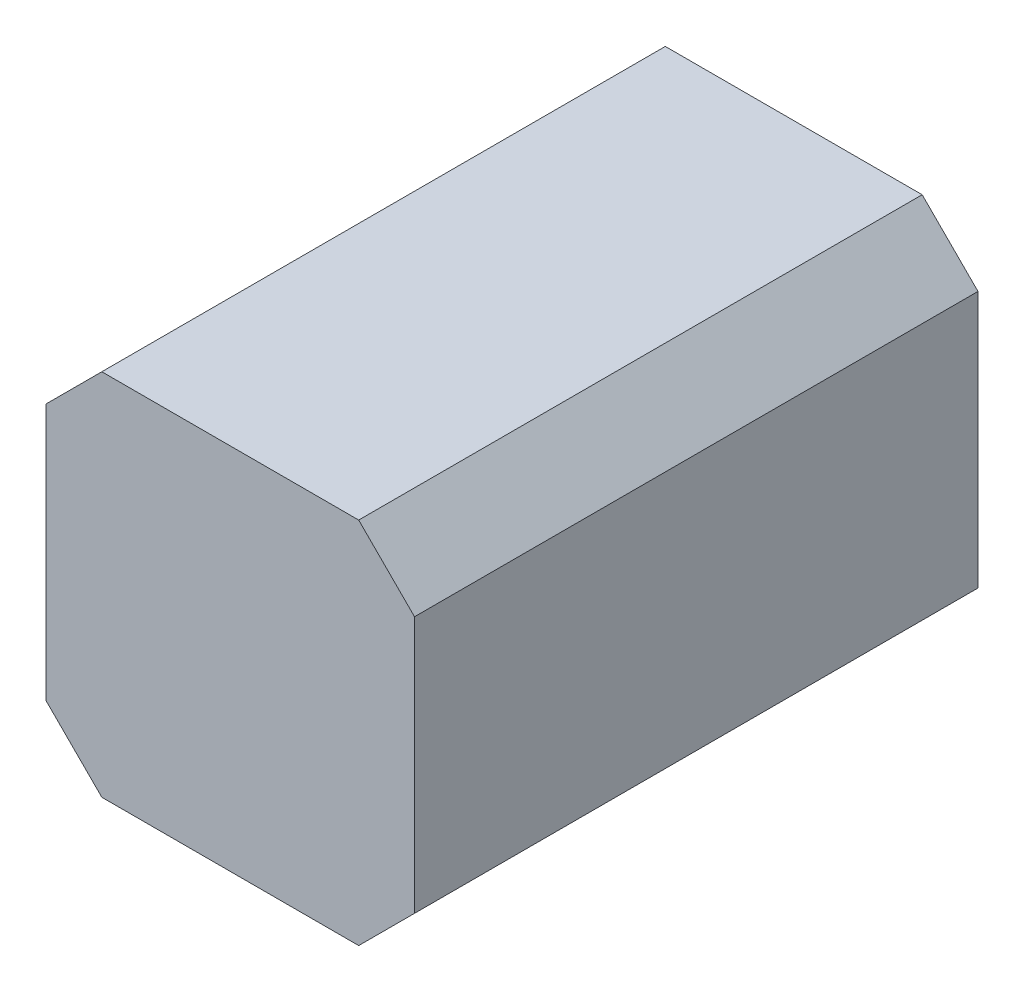
ISO-10303-21;
HEADER;
FILE_DESCRIPTION(('STEP AP214'),'2;1');
FILE_NAME('part.step','',(''),(''),'','','');
FILE_SCHEMA(('AUTOMOTIVE_DESIGN { 1 0 10303 214 1 1 1 1 }'));
ENDSEC;
DATA;
#1=APPLICATION_CONTEXT('core data for automotive mechanical design processes');
#2=APPLICATION_PROTOCOL_DEFINITION('international standard','automotive_design',2000,#1);
#3=PRODUCT_CONTEXT('',#1,'mechanical');
#4=PRODUCT('Part','Part','',(#3));
#5=PRODUCT_RELATED_PRODUCT_CATEGORY('part','',(#4));
#6=PRODUCT_DEFINITION_FORMATION('','',#4);
#7=PRODUCT_DEFINITION_CONTEXT('part definition',#1,'design');
#8=PRODUCT_DEFINITION('design','',#6,#7);
#9=PRODUCT_DEFINITION_SHAPE('','',#8);
#10=(LENGTH_UNIT() NAMED_UNIT(*) SI_UNIT(.MILLI.,.METRE.));
#11=(NAMED_UNIT(*) PLANE_ANGLE_UNIT() SI_UNIT($,.RADIAN.));
#12=(NAMED_UNIT(*) SI_UNIT($,.STERADIAN.) SOLID_ANGLE_UNIT());
#13=UNCERTAINTY_MEASURE_WITH_UNIT(LENGTH_MEASURE(1.E-05),#10,'distance_accuracy_value','');
#14=(GEOMETRIC_REPRESENTATION_CONTEXT(3) GLOBAL_UNCERTAINTY_ASSIGNED_CONTEXT((#13)) GLOBAL_UNIT_ASSIGNED_CONTEXT((#10,
#11,#12)) REPRESENTATION_CONTEXT('',''));
#15=CARTESIAN_POINT('',(0.,0.,0.));
#16=DIRECTION('',(0.,0.,1.));
#17=DIRECTION('',(1.,0.,0.));
#18=AXIS2_PLACEMENT_3D('',#15,#16,#17);
#19=CARTESIAN_POINT('',(-65.7609306503496,-65.7609306503483,237.));
#20=DIRECTION('',(-0.707106781186554,-0.707106781186541,0.));
#21=DIRECTION('',(0.707106781186541,-0.707106781186554,0.));
#22=AXIS2_PLACEMENT_3D('',#19,#20,#21);
#23=PLANE('',#22);
#24=DIRECTION('',(-0.707106781186541,0.707106781186555,0.));
#25=VECTOR('',#24,1.);
#26=CARTESIAN_POINT('',(-65.7609306503496,-65.7609306503483,0.));
#27=LINE('',#26,#25);
#28=CARTESIAN_POINT('',(-54.021861300698,-77.5,0.));
#29=VERTEX_POINT('',#28);
#30=CARTESIAN_POINT('',(-77.5,-54.0218613006976,0.));
#31=VERTEX_POINT('',#30);
#32=EDGE_CURVE('E130',#29,#31,#27,.T.);
#33=ORIENTED_EDGE('',*,*,#32,.F.);
#34=DIRECTION('',(0.,0.,-1.));
#35=VECTOR('',#34,1.);
#36=CARTESIAN_POINT('',(-54.021861300698,-77.5,237.));
#37=LINE('',#36,#35);
#38=CARTESIAN_POINT('',(-54.021861300698,-77.5,237.));
#39=VERTEX_POINT('',#38);
#40=EDGE_CURVE('E11',#39,#29,#37,.T.);
#41=ORIENTED_EDGE('',*,*,#40,.F.);
#42=DIRECTION('',(-0.707106781186541,0.707106781186555,0.));
#43=VECTOR('',#42,1.);
#44=CARTESIAN_POINT('',(-65.7609306503496,-65.7609306503483,237.));
#45=LINE('',#44,#43);
#46=CARTESIAN_POINT('',(-77.5,-54.0218613006976,237.));
#47=VERTEX_POINT('',#46);
#48=EDGE_CURVE('E150',#39,#47,#45,.T.);
#49=ORIENTED_EDGE('',*,*,#48,.T.);
#50=DIRECTION('',(0.,0.,-1.));
#51=VECTOR('',#50,1.);
#52=CARTESIAN_POINT('',(-77.5,-54.0218613006976,237.));
#53=LINE('',#52,#51);
#54=EDGE_CURVE('E53',#47,#31,#53,.T.);
#55=ORIENTED_EDGE('',*,*,#54,.T.);
#56=EDGE_LOOP('',(#33,#41,#49,#55));
#57=FACE_BOUND('',#56,.T.);
#58=ADVANCED_FACE('F37',(#57),#23,.T.);
#59=CARTESIAN_POINT('',(0.,-77.5,237.));
#60=DIRECTION('',(0.,1.,0.));
#61=DIRECTION('',(0.,0.,1.));
#62=AXIS2_PLACEMENT_3D('',#59,#60,#61);
#63=PLANE('',#62);
#64=DIRECTION('',(1.,0.,0.));
#65=VECTOR('',#64,1.);
#66=CARTESIAN_POINT('',(0.,-77.5,0.));
#67=LINE('',#66,#65);
#68=CARTESIAN_POINT('',(54.0218613006976,-77.5,0.));
#69=VERTEX_POINT('',#68);
#70=EDGE_CURVE('E132',#29,#69,#67,.T.);
#71=ORIENTED_EDGE('',*,*,#70,.T.);
#72=DIRECTION('',(0.,0.,-1.));
#73=VECTOR('',#72,1.);
#74=CARTESIAN_POINT('',(54.0218613006976,-77.5,237.));
#75=LINE('',#74,#73);
#76=CARTESIAN_POINT('',(54.0218613006976,-77.5,237.));
#77=VERTEX_POINT('',#76);
#78=EDGE_CURVE('E45',#77,#69,#75,.T.);
#79=ORIENTED_EDGE('',*,*,#78,.F.);
#80=DIRECTION('',(1.,0.,0.));
#81=VECTOR('',#80,1.);
#82=CARTESIAN_POINT('',(0.,-77.5,237.));
#83=LINE('',#82,#81);
#84=EDGE_CURVE('E177',#39,#77,#83,.T.);
#85=ORIENTED_EDGE('',*,*,#84,.F.);
#86=ORIENTED_EDGE('',*,*,#40,.T.);
#87=EDGE_LOOP('',(#71,#79,#85,#86));
#88=FACE_BOUND('',#87,.T.);
#89=ADVANCED_FACE('F166',(#88),#63,.F.);
#90=CARTESIAN_POINT('',(65.7609306503485,-65.7609306503493,237.));
#91=DIRECTION('',(0.707106781186543,-0.707106781186552,0.));
#92=DIRECTION('',(0.707106781186552,0.707106781186543,0.));
#93=AXIS2_PLACEMENT_3D('',#90,#91,#92);
#94=PLANE('',#93);
#95=DIRECTION('',(-0.707106781186552,-0.707106781186543,0.));
#96=VECTOR('',#95,1.);
#97=CARTESIAN_POINT('',(65.7609306503485,-65.7609306503493,0.));
#98=LINE('',#97,#96);
#99=CARTESIAN_POINT('',(77.5,-54.0218613006979,0.));
#100=VERTEX_POINT('',#99);
#101=EDGE_CURVE('E135',#100,#69,#98,.T.);
#102=ORIENTED_EDGE('',*,*,#101,.F.);
#103=DIRECTION('',(0.,0.,-1.));
#104=VECTOR('',#103,1.);
#105=CARTESIAN_POINT('',(77.5,-54.0218613006979,237.));
#106=LINE('',#105,#104);
#107=CARTESIAN_POINT('',(77.5,-54.0218613006979,237.));
#108=VERTEX_POINT('',#107);
#109=EDGE_CURVE('E156',#108,#100,#106,.T.);
#110=ORIENTED_EDGE('',*,*,#109,.F.);
#111=DIRECTION('',(-0.707106781186552,-0.707106781186543,0.));
#112=VECTOR('',#111,1.);
#113=CARTESIAN_POINT('',(65.7609306503485,-65.7609306503493,237.));
#114=LINE('',#113,#112);
#115=EDGE_CURVE('E163',#108,#77,#114,.T.);
#116=ORIENTED_EDGE('',*,*,#115,.T.);
#117=ORIENTED_EDGE('',*,*,#78,.T.);
#118=EDGE_LOOP('',(#102,#110,#116,#117));
#119=FACE_BOUND('',#118,.T.);
#120=ADVANCED_FACE('F161',(#119),#94,.T.);
#121=CARTESIAN_POINT('',(77.5,0.,237.));
#122=DIRECTION('',(-1.,0.,0.));
#123=DIRECTION('',(0.,0.,1.));
#124=AXIS2_PLACEMENT_3D('',#121,#122,#123);
#125=PLANE('',#124);
#126=DIRECTION('',(0.,1.,0.));
#127=VECTOR('',#126,1.);
#128=CARTESIAN_POINT('',(77.5,0.,0.));
#129=LINE('',#128,#127);
#130=CARTESIAN_POINT('',(77.5,54.0218613006978,0.));
#131=VERTEX_POINT('',#130);
#132=EDGE_CURVE('E138',#100,#131,#129,.T.);
#133=ORIENTED_EDGE('',*,*,#132,.T.);
#134=DIRECTION('',(0.,0.,-1.));
#135=VECTOR('',#134,1.);
#136=CARTESIAN_POINT('',(77.5,54.0218613006978,237.));
#137=LINE('',#136,#135);
#138=CARTESIAN_POINT('',(77.5,54.0218613006978,237.));
#139=VERTEX_POINT('',#138);
#140=EDGE_CURVE('E154',#139,#131,#137,.T.);
#141=ORIENTED_EDGE('',*,*,#140,.F.);
#142=DIRECTION('',(0.,1.,0.));
#143=VECTOR('',#142,1.);
#144=CARTESIAN_POINT('',(77.5,0.,237.));
#145=LINE('',#144,#143);
#146=EDGE_CURVE('E175',#108,#139,#145,.T.);
#147=ORIENTED_EDGE('',*,*,#146,.F.);
#148=ORIENTED_EDGE('',*,*,#109,.T.);
#149=EDGE_LOOP('',(#133,#141,#147,#148));
#150=FACE_BOUND('',#149,.T.);
#151=ADVANCED_FACE('F173',(#150),#125,.F.);
#152=CARTESIAN_POINT('',(65.7609306503491,65.7609306503487,237.));
#153=DIRECTION('',(0.707106781186549,0.707106781186546,0.));
#154=DIRECTION('',(-0.707106781186546,0.707106781186549,0.));
#155=AXIS2_PLACEMENT_3D('',#152,#153,#154);
#156=PLANE('',#155);
#157=DIRECTION('',(0.707106781186546,-0.707106781186549,0.));
#158=VECTOR('',#157,1.);
#159=CARTESIAN_POINT('',(65.7609306503491,65.7609306503487,0.));
#160=LINE('',#159,#158);
#161=CARTESIAN_POINT('',(54.0218613006979,77.5,0.));
#162=VERTEX_POINT('',#161);
#163=EDGE_CURVE('E141',#162,#131,#160,.T.);
#164=ORIENTED_EDGE('',*,*,#163,.F.);
#165=DIRECTION('',(0.,0.,-1.));
#166=VECTOR('',#165,1.);
#167=CARTESIAN_POINT('',(54.0218613006979,77.5,237.));
#168=LINE('',#167,#166);
#169=CARTESIAN_POINT('',(54.0218613006979,77.5,237.));
#170=VERTEX_POINT('',#169);
#171=EDGE_CURVE('E112',#170,#162,#168,.T.);
#172=ORIENTED_EDGE('',*,*,#171,.F.);
#173=DIRECTION('',(0.707106781186546,-0.707106781186549,0.));
#174=VECTOR('',#173,1.);
#175=CARTESIAN_POINT('',(65.7609306503491,65.7609306503487,237.));
#176=LINE('',#175,#174);
#177=EDGE_CURVE('E122',#170,#139,#176,.T.);
#178=ORIENTED_EDGE('',*,*,#177,.T.);
#179=ORIENTED_EDGE('',*,*,#140,.T.);
#180=EDGE_LOOP('',(#164,#172,#178,#179));
#181=FACE_BOUND('',#180,.T.);
#182=ADVANCED_FACE('F182',(#181),#156,.T.);
#183=CARTESIAN_POINT('',(0.,77.5,237.));
#184=DIRECTION('',(0.,1.,0.));
#185=DIRECTION('',(0.,0.,1.));
#186=AXIS2_PLACEMENT_3D('',#183,#184,#185);
#187=PLANE('',#186);
#188=DIRECTION('',(1.,0.,0.));
#189=VECTOR('',#188,1.);
#190=CARTESIAN_POINT('',(0.,77.5,0.));
#191=LINE('',#190,#189);
#192=CARTESIAN_POINT('',(-54.0218613006978,77.5,0.));
#193=VERTEX_POINT('',#192);
#194=EDGE_CURVE('E108',#193,#162,#191,.T.);
#195=ORIENTED_EDGE('',*,*,#194,.F.);
#196=DIRECTION('',(0.,0.,-1.));
#197=VECTOR('',#196,1.);
#198=CARTESIAN_POINT('',(-54.0218613006978,77.5,237.));
#199=LINE('',#198,#197);
#200=CARTESIAN_POINT('',(-54.0218613006978,77.5,237.));
#201=VERTEX_POINT('',#200);
#202=EDGE_CURVE('E103',#201,#193,#199,.T.);
#203=ORIENTED_EDGE('',*,*,#202,.F.);
#204=DIRECTION('',(1.,0.,0.));
#205=VECTOR('',#204,1.);
#206=CARTESIAN_POINT('',(0.,77.5,237.));
#207=LINE('',#206,#205);
#208=EDGE_CURVE('E106',#201,#170,#207,.T.);
#209=ORIENTED_EDGE('',*,*,#208,.T.);
#210=ORIENTED_EDGE('',*,*,#171,.T.);
#211=EDGE_LOOP('',(#195,#203,#209,#210));
#212=FACE_BOUND('',#211,.T.);
#213=ADVANCED_FACE('F105',(#212),#187,.T.);
#214=CARTESIAN_POINT('',(-65.7609306503489,65.7609306503489,237.));
#215=DIRECTION('',(-0.707106781186548,0.707106781186547,0.));
#216=DIRECTION('',(-0.707106781186547,-0.707106781186548,0.));
#217=AXIS2_PLACEMENT_3D('',#214,#215,#216);
#218=PLANE('',#217);
#219=DIRECTION('',(0.707106781186547,0.707106781186548,0.));
#220=VECTOR('',#219,1.);
#221=CARTESIAN_POINT('',(-65.7609306503489,65.7609306503489,0.));
#222=LINE('',#221,#220);
#223=CARTESIAN_POINT('',(-77.5,54.0218613006978,0.));
#224=VERTEX_POINT('',#223);
#225=EDGE_CURVE('E145',#224,#193,#222,.T.);
#226=ORIENTED_EDGE('',*,*,#225,.F.);
#227=DIRECTION('',(0.,0.,-1.));
#228=VECTOR('',#227,1.);
#229=CARTESIAN_POINT('',(-77.5,54.0218613006978,237.));
#230=LINE('',#229,#228);
#231=CARTESIAN_POINT('',(-77.5,54.0218613006978,237.));
#232=VERTEX_POINT('',#231);
#233=EDGE_CURVE('E78',#232,#224,#230,.T.);
#234=ORIENTED_EDGE('',*,*,#233,.F.);
#235=DIRECTION('',(0.707106781186547,0.707106781186548,0.));
#236=VECTOR('',#235,1.);
#237=CARTESIAN_POINT('',(-65.7609306503489,65.7609306503489,237.));
#238=LINE('',#237,#236);
#239=EDGE_CURVE('E120',#232,#201,#238,.T.);
#240=ORIENTED_EDGE('',*,*,#239,.T.);
#241=ORIENTED_EDGE('',*,*,#202,.T.);
#242=EDGE_LOOP('',(#226,#234,#240,#241));
#243=FACE_BOUND('',#242,.T.);
#244=ADVANCED_FACE('F124',(#243),#218,.T.);
#245=CARTESIAN_POINT('',(-77.5,0.,237.));
#246=DIRECTION('',(-1.,0.,0.));
#247=DIRECTION('',(0.,0.,1.));
#248=AXIS2_PLACEMENT_3D('',#245,#246,#247);
#249=PLANE('',#248);
#250=DIRECTION('',(0.,1.,0.));
#251=VECTOR('',#250,1.);
#252=CARTESIAN_POINT('',(-77.5,0.,0.));
#253=LINE('',#252,#251);
#254=EDGE_CURVE('E147',#31,#224,#253,.T.);
#255=ORIENTED_EDGE('',*,*,#254,.F.);
#256=ORIENTED_EDGE('',*,*,#54,.F.);
#257=DIRECTION('',(0.,1.,0.));
#258=VECTOR('',#257,1.);
#259=CARTESIAN_POINT('',(-77.5,0.,237.));
#260=LINE('',#259,#258);
#261=EDGE_CURVE('E125',#47,#232,#260,.T.);
#262=ORIENTED_EDGE('',*,*,#261,.T.);
#263=ORIENTED_EDGE('',*,*,#233,.T.);
#264=EDGE_LOOP('',(#255,#256,#262,#263));
#265=FACE_BOUND('',#264,.T.);
#266=ADVANCED_FACE('F183',(#265),#249,.T.);
#267=CARTESIAN_POINT('',(0.,0.,237.));
#268=DIRECTION('',(0.,0.,1.));
#269=DIRECTION('',(1.,0.,0.));
#270=AXIS2_PLACEMENT_3D('',#267,#268,#269);
#271=PLANE('',#270);
#272=ORIENTED_EDGE('',*,*,#48,.F.);
#273=ORIENTED_EDGE('',*,*,#84,.T.);
#274=ORIENTED_EDGE('',*,*,#115,.F.);
#275=ORIENTED_EDGE('',*,*,#146,.T.);
#276=ORIENTED_EDGE('',*,*,#177,.F.);
#277=ORIENTED_EDGE('',*,*,#208,.F.);
#278=ORIENTED_EDGE('',*,*,#239,.F.);
#279=ORIENTED_EDGE('',*,*,#261,.F.);
#280=EDGE_LOOP('',(#272,#273,#274,#275,#276,#277,#278,#279));
#281=FACE_BOUND('',#280,.T.);
#282=ADVANCED_FACE('F118',(#281),#271,.T.);
#283=CARTESIAN_POINT('',(0.,0.,0.));
#284=DIRECTION('',(0.,0.,1.));
#285=DIRECTION('',(1.,0.,0.));
#286=AXIS2_PLACEMENT_3D('',#283,#284,#285);
#287=PLANE('',#286);
#288=ORIENTED_EDGE('',*,*,#32,.T.);
#289=ORIENTED_EDGE('',*,*,#254,.T.);
#290=ORIENTED_EDGE('',*,*,#225,.T.);
#291=ORIENTED_EDGE('',*,*,#194,.T.);
#292=ORIENTED_EDGE('',*,*,#163,.T.);
#293=ORIENTED_EDGE('',*,*,#132,.F.);
#294=ORIENTED_EDGE('',*,*,#101,.T.);
#295=ORIENTED_EDGE('',*,*,#70,.F.);
#296=EDGE_LOOP('',(#288,#289,#290,#291,#292,#293,#294,#295));
#297=FACE_BOUND('',#296,.T.);
#298=ADVANCED_FACE('F169',(#297),#287,.F.);
#299=CLOSED_SHELL('',(#58,#89,#120,#151,#182,#213,#244,#266,#282,#298));
#300=MANIFOLD_SOLID_BREP('B2',#299);
#301=ADVANCED_BREP_SHAPE_REPRESENTATION('',(#18,#300),#14);
#302=SHAPE_DEFINITION_REPRESENTATION(#9,#301);
ENDSEC;
END-ISO-10303-21;
